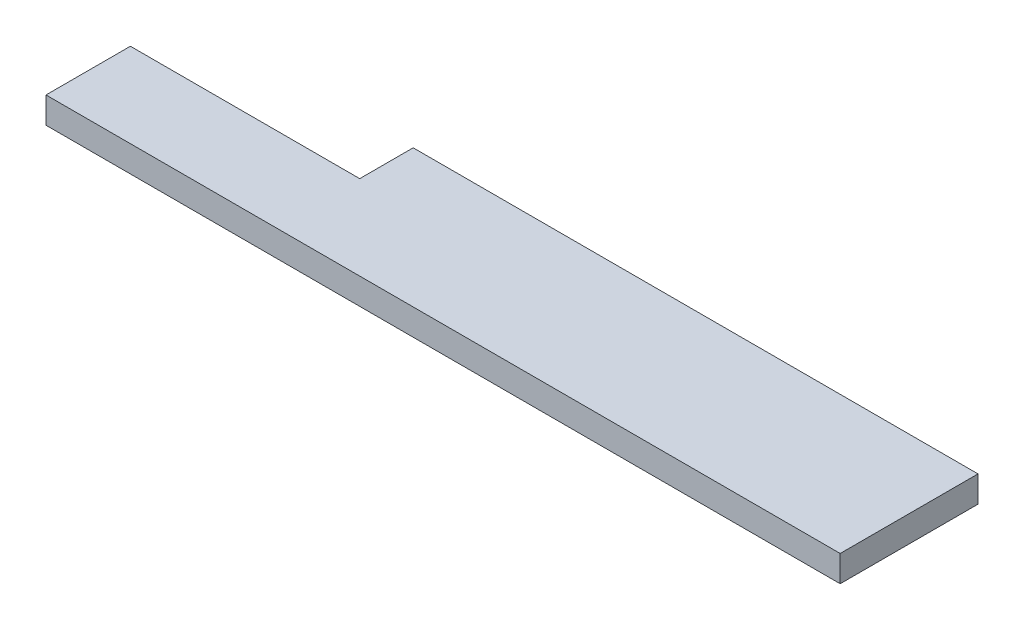
ISO-10303-21;
HEADER;
FILE_DESCRIPTION(('STEP AP214'),'2;1');
FILE_NAME('part.step','',(''),(''),'','','');
FILE_SCHEMA(('AUTOMOTIVE_DESIGN { 1 0 10303 214 1 1 1 1 }'));
ENDSEC;
DATA;
#1=APPLICATION_CONTEXT('core data for automotive mechanical design processes');
#2=APPLICATION_PROTOCOL_DEFINITION('international standard','automotive_design',2000,#1);
#3=PRODUCT_CONTEXT('',#1,'mechanical');
#4=PRODUCT('Part','Part','',(#3));
#5=PRODUCT_RELATED_PRODUCT_CATEGORY('part','',(#4));
#6=PRODUCT_DEFINITION_FORMATION('','',#4);
#7=PRODUCT_DEFINITION_CONTEXT('part definition',#1,'design');
#8=PRODUCT_DEFINITION('design','',#6,#7);
#9=PRODUCT_DEFINITION_SHAPE('','',#8);
#10=(LENGTH_UNIT() NAMED_UNIT(*) SI_UNIT(.MILLI.,.METRE.));
#11=(NAMED_UNIT(*) PLANE_ANGLE_UNIT() SI_UNIT($,.RADIAN.));
#12=(NAMED_UNIT(*) SI_UNIT($,.STERADIAN.) SOLID_ANGLE_UNIT());
#13=UNCERTAINTY_MEASURE_WITH_UNIT(LENGTH_MEASURE(1.E-05),#10,'distance_accuracy_value','');
#14=(GEOMETRIC_REPRESENTATION_CONTEXT(3) GLOBAL_UNCERTAINTY_ASSIGNED_CONTEXT((#13)) GLOBAL_UNIT_ASSIGNED_CONTEXT((#10,
#11,#12)) REPRESENTATION_CONTEXT('',''));
#15=CARTESIAN_POINT('',(0.,0.,0.));
#16=DIRECTION('',(0.,0.,1.));
#17=DIRECTION('',(1.,0.,0.));
#18=AXIS2_PLACEMENT_3D('',#15,#16,#17);
#19=CARTESIAN_POINT('',(-60.5,4.,-10.5));
#20=DIRECTION('',(0.,0.,1.));
#21=DIRECTION('',(1.,0.,0.));
#22=AXIS2_PLACEMENT_3D('',#19,#20,#21);
#23=PLANE('',#22);
#24=DIRECTION('',(0.,-1.,0.));
#25=VECTOR('',#24,1.);
#26=CARTESIAN_POINT('',(-25.5574773330221,4.,-10.5));
#27=LINE('',#26,#25);
#28=CARTESIAN_POINT('',(-25.5574773330221,4.,-10.5));
#29=VERTEX_POINT('',#28);
#30=CARTESIAN_POINT('',(-25.5574773330221,0.,-10.5));
#31=VERTEX_POINT('',#30);
#32=EDGE_CURVE('E48',#29,#31,#27,.T.);
#33=ORIENTED_EDGE('',*,*,#32,.F.);
#34=DIRECTION('',(-1.,0.,0.));
#35=VECTOR('',#34,1.);
#36=CARTESIAN_POINT('',(-60.5,4.,-10.5));
#37=LINE('',#36,#35);
#38=CARTESIAN_POINT('',(60.5,4.,-10.5));
#39=VERTEX_POINT('',#38);
#40=EDGE_CURVE('E80',#39,#29,#37,.T.);
#41=ORIENTED_EDGE('',*,*,#40,.F.);
#42=DIRECTION('',(0.,-1.,0.));
#43=VECTOR('',#42,1.);
#44=CARTESIAN_POINT('',(60.5,4.,-10.5));
#45=LINE('',#44,#43);
#46=CARTESIAN_POINT('',(60.5,0.,-10.5));
#47=VERTEX_POINT('',#46);
#48=EDGE_CURVE('E41',#39,#47,#45,.T.);
#49=ORIENTED_EDGE('',*,*,#48,.T.);
#50=DIRECTION('',(-1.,0.,0.));
#51=VECTOR('',#50,1.);
#52=CARTESIAN_POINT('',(-60.5,0.,-10.5));
#53=LINE('',#52,#51);
#54=EDGE_CURVE('E125',#47,#31,#53,.T.);
#55=ORIENTED_EDGE('',*,*,#54,.T.);
#56=EDGE_LOOP('',(#33,#41,#49,#55));
#57=FACE_BOUND('',#56,.T.);
#58=ADVANCED_FACE('F33',(#57),#23,.F.);
#59=CARTESIAN_POINT('',(-60.5,4.,10.5));
#60=DIRECTION('',(1.,0.,0.));
#61=DIRECTION('',(0.,0.,-1.));
#62=AXIS2_PLACEMENT_3D('',#59,#60,#61);
#63=PLANE('',#62);
#64=DIRECTION('',(0.,1.,0.));
#65=VECTOR('',#64,1.);
#66=CARTESIAN_POINT('',(-60.5,4.,-2.35724240285242));
#67=LINE('',#66,#65);
#68=CARTESIAN_POINT('',(-60.5,0.,-2.35724240285242));
#69=VERTEX_POINT('',#68);
#70=CARTESIAN_POINT('',(-60.5,4.,-2.35724240285242));
#71=VERTEX_POINT('',#70);
#72=EDGE_CURVE('E101',#69,#71,#67,.T.);
#73=ORIENTED_EDGE('',*,*,#72,.F.);
#74=DIRECTION('',(0.,0.,1.));
#75=VECTOR('',#74,1.);
#76=CARTESIAN_POINT('',(-60.5,0.,10.5));
#77=LINE('',#76,#75);
#78=CARTESIAN_POINT('',(-60.5,0.,10.5));
#79=VERTEX_POINT('',#78);
#80=EDGE_CURVE('E128',#69,#79,#77,.T.);
#81=ORIENTED_EDGE('',*,*,#80,.T.);
#82=DIRECTION('',(0.,-1.,0.));
#83=VECTOR('',#82,1.);
#84=CARTESIAN_POINT('',(-60.5,4.,10.5));
#85=LINE('',#84,#83);
#86=CARTESIAN_POINT('',(-60.5,4.,10.5));
#87=VERTEX_POINT('',#86);
#88=EDGE_CURVE('E132',#87,#79,#85,.T.);
#89=ORIENTED_EDGE('',*,*,#88,.F.);
#90=DIRECTION('',(0.,0.,1.));
#91=VECTOR('',#90,1.);
#92=CARTESIAN_POINT('',(-60.5,4.,10.5));
#93=LINE('',#92,#91);
#94=EDGE_CURVE('E119',#71,#87,#93,.T.);
#95=ORIENTED_EDGE('',*,*,#94,.F.);
#96=EDGE_LOOP('',(#73,#81,#89,#95));
#97=FACE_BOUND('',#96,.T.);
#98=ADVANCED_FACE('F141',(#97),#63,.F.);
#99=CARTESIAN_POINT('',(0.,4.,0.));
#100=DIRECTION('',(0.,-1.,0.));
#101=DIRECTION('',(0.,0.,-1.));
#102=AXIS2_PLACEMENT_3D('',#99,#100,#101);
#103=PLANE('',#102);
#104=DIRECTION('',(1.,0.,0.));
#105=VECTOR('',#104,1.);
#106=CARTESIAN_POINT('',(-62.1510691930141,4.,-2.35724240285242));
#107=LINE('',#106,#105);
#108=CARTESIAN_POINT('',(-25.5574773330221,4.,-2.35724240285242));
#109=VERTEX_POINT('',#108);
#110=EDGE_CURVE('E96',#71,#109,#107,.T.);
#111=ORIENTED_EDGE('',*,*,#110,.F.);
#112=ORIENTED_EDGE('',*,*,#94,.T.);
#113=DIRECTION('',(1.,0.,0.));
#114=VECTOR('',#113,1.);
#115=CARTESIAN_POINT('',(-60.5,4.,10.5));
#116=LINE('',#115,#114);
#117=CARTESIAN_POINT('',(60.5,4.,10.5));
#118=VERTEX_POINT('',#117);
#119=EDGE_CURVE('E57',#87,#118,#116,.T.);
#120=ORIENTED_EDGE('',*,*,#119,.T.);
#121=DIRECTION('',(0.,0.,-1.));
#122=VECTOR('',#121,1.);
#123=CARTESIAN_POINT('',(60.5,4.,10.5));
#124=LINE('',#123,#122);
#125=EDGE_CURVE('E116',#118,#39,#124,.T.);
#126=ORIENTED_EDGE('',*,*,#125,.T.);
#127=ORIENTED_EDGE('',*,*,#40,.T.);
#128=DIRECTION('',(0.,0.,-1.));
#129=VECTOR('',#128,1.);
#130=CARTESIAN_POINT('',(-25.5574773330221,4.,-10.5));
#131=LINE('',#130,#129);
#132=EDGE_CURVE('E104',#109,#29,#131,.T.);
#133=ORIENTED_EDGE('',*,*,#132,.F.);
#134=EDGE_LOOP('',(#111,#112,#120,#126,#127,#133));
#135=FACE_BOUND('',#134,.T.);
#136=ADVANCED_FACE('F109',(#135),#103,.F.);
#137=CARTESIAN_POINT('',(0.,0.,0.));
#138=DIRECTION('',(0.,-1.,0.));
#139=DIRECTION('',(0.,0.,-1.));
#140=AXIS2_PLACEMENT_3D('',#137,#138,#139);
#141=PLANE('',#140);
#142=ORIENTED_EDGE('',*,*,#80,.F.);
#143=DIRECTION('',(1.,0.,0.));
#144=VECTOR('',#143,1.);
#145=CARTESIAN_POINT('',(0.,0.,-2.35724240285242));
#146=LINE('',#145,#144);
#147=CARTESIAN_POINT('',(-25.5574773330221,0.,-2.35724240285242));
#148=VERTEX_POINT('',#147);
#149=EDGE_CURVE('E11',#69,#148,#146,.T.);
#150=ORIENTED_EDGE('',*,*,#149,.T.);
#151=DIRECTION('',(0.,0.,-1.));
#152=VECTOR('',#151,1.);
#153=CARTESIAN_POINT('',(-25.5574773330221,0.,-10.5));
#154=LINE('',#153,#152);
#155=EDGE_CURVE('E105',#148,#31,#154,.T.);
#156=ORIENTED_EDGE('',*,*,#155,.T.);
#157=ORIENTED_EDGE('',*,*,#54,.F.);
#158=DIRECTION('',(0.,0.,-1.));
#159=VECTOR('',#158,1.);
#160=CARTESIAN_POINT('',(60.5,0.,10.5));
#161=LINE('',#160,#159);
#162=CARTESIAN_POINT('',(60.5,0.,10.5));
#163=VERTEX_POINT('',#162);
#164=EDGE_CURVE('E115',#163,#47,#161,.T.);
#165=ORIENTED_EDGE('',*,*,#164,.F.);
#166=DIRECTION('',(1.,0.,0.));
#167=VECTOR('',#166,1.);
#168=CARTESIAN_POINT('',(-60.5,0.,10.5));
#169=LINE('',#168,#167);
#170=EDGE_CURVE('E74',#79,#163,#169,.T.);
#171=ORIENTED_EDGE('',*,*,#170,.F.);
#172=EDGE_LOOP('',(#142,#150,#156,#157,#165,#171));
#173=FACE_BOUND('',#172,.T.);
#174=ADVANCED_FACE('F139',(#173),#141,.T.);
#175=CARTESIAN_POINT('',(60.5,4.,10.5));
#176=DIRECTION('',(-1.,0.,0.));
#177=DIRECTION('',(0.,0.,1.));
#178=AXIS2_PLACEMENT_3D('',#175,#176,#177);
#179=PLANE('',#178);
#180=ORIENTED_EDGE('',*,*,#164,.T.);
#181=ORIENTED_EDGE('',*,*,#48,.F.);
#182=ORIENTED_EDGE('',*,*,#125,.F.);
#183=DIRECTION('',(0.,-1.,0.));
#184=VECTOR('',#183,1.);
#185=CARTESIAN_POINT('',(60.5,4.,10.5));
#186=LINE('',#185,#184);
#187=EDGE_CURVE('E122',#118,#163,#186,.T.);
#188=ORIENTED_EDGE('',*,*,#187,.T.);
#189=EDGE_LOOP('',(#180,#181,#182,#188));
#190=FACE_BOUND('',#189,.T.);
#191=ADVANCED_FACE('F35',(#190),#179,.F.);
#192=CARTESIAN_POINT('',(-60.5,4.,10.5));
#193=DIRECTION('',(0.,0.,-1.));
#194=DIRECTION('',(-1.,0.,0.));
#195=AXIS2_PLACEMENT_3D('',#192,#193,#194);
#196=PLANE('',#195);
#197=ORIENTED_EDGE('',*,*,#170,.T.);
#198=ORIENTED_EDGE('',*,*,#187,.F.);
#199=ORIENTED_EDGE('',*,*,#119,.F.);
#200=ORIENTED_EDGE('',*,*,#88,.T.);
#201=EDGE_LOOP('',(#197,#198,#199,#200));
#202=FACE_BOUND('',#201,.T.);
#203=ADVANCED_FACE('F143',(#202),#196,.F.);
#204=CARTESIAN_POINT('',(-62.1510691930141,4.,-2.35724240285242));
#205=DIRECTION('',(0.,0.,-1.));
#206=DIRECTION('',(-1.,0.,0.));
#207=AXIS2_PLACEMENT_3D('',#204,#205,#206);
#208=PLANE('',#207);
#209=ORIENTED_EDGE('',*,*,#72,.T.);
#210=ORIENTED_EDGE('',*,*,#110,.T.);
#211=DIRECTION('',(0.,-1.,0.));
#212=VECTOR('',#211,1.);
#213=CARTESIAN_POINT('',(-25.5574773330221,4.,-2.35724240285242));
#214=LINE('',#213,#212);
#215=EDGE_CURVE('E99',#109,#148,#214,.T.);
#216=ORIENTED_EDGE('',*,*,#215,.T.);
#217=ORIENTED_EDGE('',*,*,#149,.F.);
#218=EDGE_LOOP('',(#209,#210,#216,#217));
#219=FACE_BOUND('',#218,.T.);
#220=ADVANCED_FACE('F98',(#219),#208,.T.);
#221=CARTESIAN_POINT('',(-25.5574773330221,4.,-10.5));
#222=DIRECTION('',(-1.,0.,0.));
#223=DIRECTION('',(0.,0.,1.));
#224=AXIS2_PLACEMENT_3D('',#221,#222,#223);
#225=PLANE('',#224);
#226=ORIENTED_EDGE('',*,*,#155,.F.);
#227=ORIENTED_EDGE('',*,*,#215,.F.);
#228=ORIENTED_EDGE('',*,*,#132,.T.);
#229=ORIENTED_EDGE('',*,*,#32,.T.);
#230=EDGE_LOOP('',(#226,#227,#228,#229));
#231=FACE_BOUND('',#230,.T.);
#232=ADVANCED_FACE('F107',(#231),#225,.T.);
#233=CLOSED_SHELL('',(#58,#98,#136,#174,#191,#203,#220,#232));
#234=MANIFOLD_SOLID_BREP('B2',#233);
#235=ADVANCED_BREP_SHAPE_REPRESENTATION('',(#18,#234),#14);
#236=SHAPE_DEFINITION_REPRESENTATION(#9,#235);
ENDSEC;
END-ISO-10303-21;
